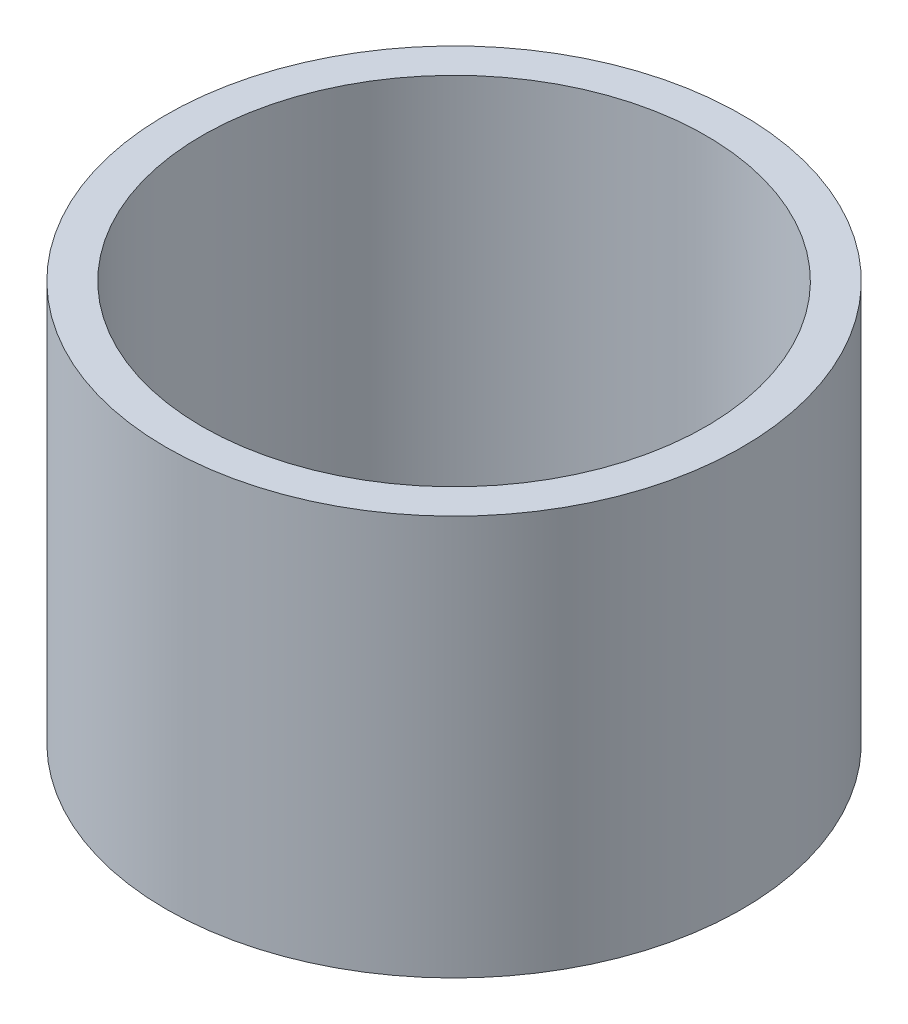
ISO-10303-21;
HEADER;
FILE_DESCRIPTION(('STEP AP214'),'2;1');
FILE_NAME('part.step','',(''),(''),'','','');
FILE_SCHEMA(('AUTOMOTIVE_DESIGN { 1 0 10303 214 1 1 1 1 }'));
ENDSEC;
DATA;
#1=APPLICATION_CONTEXT('core data for automotive mechanical design processes');
#2=APPLICATION_PROTOCOL_DEFINITION('international standard','automotive_design',2000,#1);
#3=PRODUCT_CONTEXT('',#1,'mechanical');
#4=PRODUCT('Part','Part','',(#3));
#5=PRODUCT_RELATED_PRODUCT_CATEGORY('part','',(#4));
#6=PRODUCT_DEFINITION_FORMATION('','',#4);
#7=PRODUCT_DEFINITION_CONTEXT('part definition',#1,'design');
#8=PRODUCT_DEFINITION('design','',#6,#7);
#9=PRODUCT_DEFINITION_SHAPE('','',#8);
#10=(LENGTH_UNIT() NAMED_UNIT(*) SI_UNIT(.MILLI.,.METRE.));
#11=(NAMED_UNIT(*) PLANE_ANGLE_UNIT() SI_UNIT($,.RADIAN.));
#12=(NAMED_UNIT(*) SI_UNIT($,.STERADIAN.) SOLID_ANGLE_UNIT());
#13=UNCERTAINTY_MEASURE_WITH_UNIT(LENGTH_MEASURE(1.E-05),#10,'distance_accuracy_value','');
#14=(GEOMETRIC_REPRESENTATION_CONTEXT(3) GLOBAL_UNCERTAINTY_ASSIGNED_CONTEXT((#13)) GLOBAL_UNIT_ASSIGNED_CONTEXT((#10,
#11,#12)) REPRESENTATION_CONTEXT('',''));
#15=CARTESIAN_POINT('',(0.,0.,0.));
#16=DIRECTION('',(0.,0.,1.));
#17=DIRECTION('',(1.,0.,0.));
#18=AXIS2_PLACEMENT_3D('',#15,#16,#17);
#19=CARTESIAN_POINT('',(0.,5.,0.));
#20=DIRECTION('',(0.,-1.,0.));
#21=DIRECTION('',(0.,0.,-1.));
#22=AXIS2_PLACEMENT_3D('',#19,#20,#21);
#23=CYLINDRICAL_SURFACE('',#22,3.6);
#24=CARTESIAN_POINT('',(0.,5.,0.));
#25=DIRECTION('',(0.,1.,0.));
#26=DIRECTION('',(0.,0.,1.));
#27=AXIS2_PLACEMENT_3D('',#24,#25,#26);
#28=CIRCLE('',#27,3.6);
#29=CARTESIAN_POINT('',(0.,5.,3.6));
#30=VERTEX_POINT('',#29);
#31=EDGE_CURVE('E10',#30,#30,#28,.T.);
#32=ORIENTED_EDGE('',*,*,#31,.F.);
#33=EDGE_LOOP('',(#32));
#34=FACE_BOUND('',#33,.T.);
#35=CARTESIAN_POINT('',(0.,0.,0.));
#36=DIRECTION('',(0.,1.,0.));
#37=DIRECTION('',(0.,0.,1.));
#38=AXIS2_PLACEMENT_3D('',#35,#36,#37);
#39=CIRCLE('',#38,3.6);
#40=CARTESIAN_POINT('',(0.,0.,3.6));
#41=VERTEX_POINT('',#40);
#42=EDGE_CURVE('E46',#41,#41,#39,.T.);
#43=ORIENTED_EDGE('',*,*,#42,.T.);
#44=EDGE_LOOP('',(#43));
#45=FACE_BOUND('',#44,.T.);
#46=ADVANCED_FACE('F43',(#34,#45),#23,.T.);
#47=CARTESIAN_POINT('',(0.,5.,0.));
#48=DIRECTION('',(0.,1.,0.));
#49=DIRECTION('',(0.,0.,1.));
#50=AXIS2_PLACEMENT_3D('',#47,#48,#49);
#51=PLANE('',#50);
#52=CARTESIAN_POINT('',(0.,5.,0.));
#53=DIRECTION('',(0.,1.,0.));
#54=DIRECTION('',(0.,0.,1.));
#55=AXIS2_PLACEMENT_3D('',#52,#53,#54);
#56=CIRCLE('',#55,3.15);
#57=CARTESIAN_POINT('',(0.,5.,3.15));
#58=VERTEX_POINT('',#57);
#59=EDGE_CURVE('E57',#58,#58,#56,.T.);
#60=ORIENTED_EDGE('',*,*,#59,.F.);
#61=EDGE_LOOP('',(#60));
#62=FACE_BOUND('',#61,.T.);
#63=ORIENTED_EDGE('',*,*,#31,.T.);
#64=EDGE_LOOP('',(#63));
#65=FACE_BOUND('',#64,.T.);
#66=ADVANCED_FACE('F74',(#62,#65),#51,.T.);
#67=CARTESIAN_POINT('',(0.,0.,0.));
#68=DIRECTION('',(0.,1.,0.));
#69=DIRECTION('',(0.,0.,1.));
#70=AXIS2_PLACEMENT_3D('',#67,#68,#69);
#71=PLANE('',#70);
#72=ORIENTED_EDGE('',*,*,#42,.F.);
#73=EDGE_LOOP('',(#72));
#74=FACE_BOUND('',#73,.T.);
#75=ADVANCED_FACE('F70',(#74),#71,.F.);
#76=CARTESIAN_POINT('',(0.,0.5,0.));
#77=DIRECTION('',(0.,1.,0.));
#78=DIRECTION('',(0.,0.,1.));
#79=AXIS2_PLACEMENT_3D('',#76,#77,#78);
#80=CYLINDRICAL_SURFACE('',#79,3.15);
#81=CARTESIAN_POINT('',(0.,0.5,0.));
#82=DIRECTION('',(0.,1.,0.));
#83=DIRECTION('',(0.,0.,1.));
#84=AXIS2_PLACEMENT_3D('',#81,#82,#83);
#85=CIRCLE('',#84,3.15);
#86=CARTESIAN_POINT('',(0.,0.5,3.15));
#87=VERTEX_POINT('',#86);
#88=EDGE_CURVE('E55',#87,#87,#85,.T.);
#89=ORIENTED_EDGE('',*,*,#88,.F.);
#90=EDGE_LOOP('',(#89));
#91=FACE_BOUND('',#90,.T.);
#92=ORIENTED_EDGE('',*,*,#59,.T.);
#93=EDGE_LOOP('',(#92));
#94=FACE_BOUND('',#93,.T.);
#95=ADVANCED_FACE('F67',(#91,#94),#80,.F.);
#96=CARTESIAN_POINT('',(0.,0.5,0.));
#97=DIRECTION('',(0.,1.,0.));
#98=DIRECTION('',(0.,0.,1.));
#99=AXIS2_PLACEMENT_3D('',#96,#97,#98);
#100=PLANE('',#99);
#101=ORIENTED_EDGE('',*,*,#88,.T.);
#102=EDGE_LOOP('',(#101));
#103=FACE_BOUND('',#102,.T.);
#104=ADVANCED_FACE('F65',(#103),#100,.T.);
#105=CLOSED_SHELL('',(#46,#66,#75,#95,#104));
#106=MANIFOLD_SOLID_BREP('B2',#105);
#107=ADVANCED_BREP_SHAPE_REPRESENTATION('',(#18,#106),#14);
#108=SHAPE_DEFINITION_REPRESENTATION(#9,#107);
ENDSEC;
END-ISO-10303-21;
